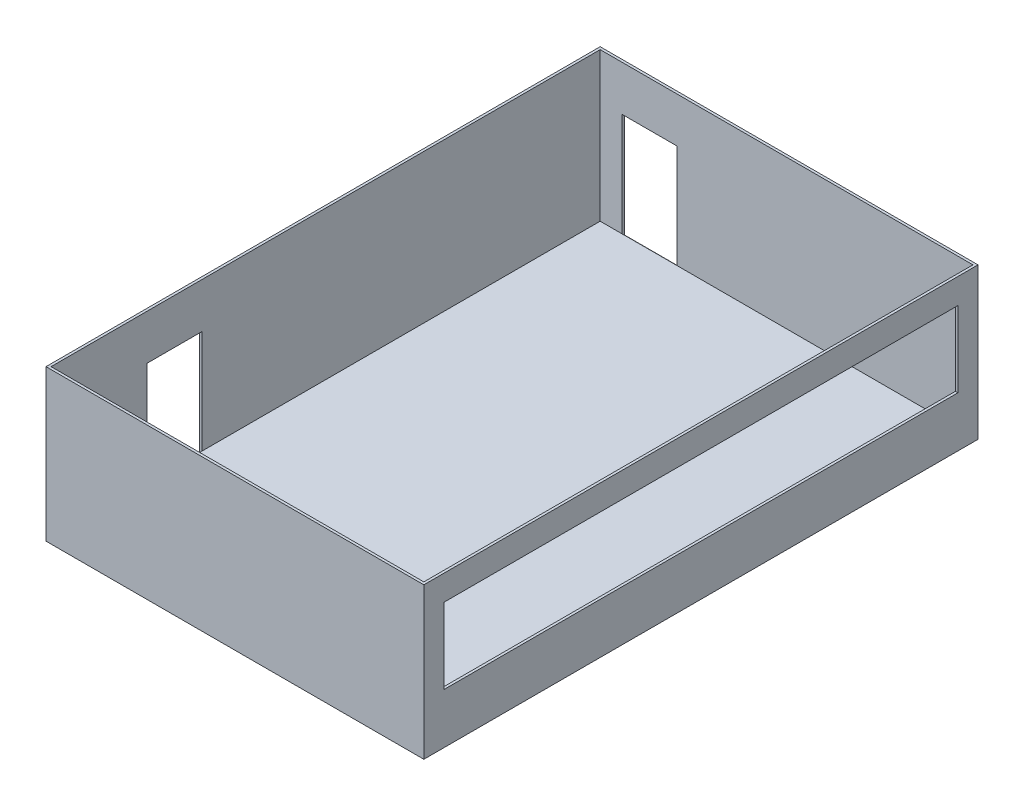
ISO-10303-21;
HEADER;
FILE_DESCRIPTION(('STEP AP214'),'2;1');
FILE_NAME('part.step','',(''),(''),'','','');
FILE_SCHEMA(('AUTOMOTIVE_DESIGN { 1 0 10303 214 1 1 1 1 }'));
ENDSEC;
DATA;
#1=APPLICATION_CONTEXT('core data for automotive mechanical design processes');
#2=APPLICATION_PROTOCOL_DEFINITION('international standard','automotive_design',2000,#1);
#3=PRODUCT_CONTEXT('',#1,'mechanical');
#4=PRODUCT('Part','Part','',(#3));
#5=PRODUCT_RELATED_PRODUCT_CATEGORY('part','',(#4));
#6=PRODUCT_DEFINITION_FORMATION('','',#4);
#7=PRODUCT_DEFINITION_CONTEXT('part definition',#1,'design');
#8=PRODUCT_DEFINITION('design','',#6,#7);
#9=PRODUCT_DEFINITION_SHAPE('','',#8);
#10=(LENGTH_UNIT() NAMED_UNIT(*) SI_UNIT(.MILLI.,.METRE.));
#11=(NAMED_UNIT(*) PLANE_ANGLE_UNIT() SI_UNIT($,.RADIAN.));
#12=(NAMED_UNIT(*) SI_UNIT($,.STERADIAN.) SOLID_ANGLE_UNIT());
#13=UNCERTAINTY_MEASURE_WITH_UNIT(LENGTH_MEASURE(1.E-05),#10,'distance_accuracy_value','');
#14=(GEOMETRIC_REPRESENTATION_CONTEXT(3) GLOBAL_UNCERTAINTY_ASSIGNED_CONTEXT((#13)) GLOBAL_UNIT_ASSIGNED_CONTEXT((#10,
#11,#12)) REPRESENTATION_CONTEXT('',''));
#15=CARTESIAN_POINT('',(0.,0.,0.));
#16=DIRECTION('',(0.,0.,1.));
#17=DIRECTION('',(1.,0.,0.));
#18=AXIS2_PLACEMENT_3D('',#15,#16,#17);
#19=CARTESIAN_POINT('',(-3750.,3000.,5500.));
#20=DIRECTION('',(1.,0.,0.));
#21=DIRECTION('',(0.,0.,-1.));
#22=AXIS2_PLACEMENT_3D('',#19,#20,#21);
#23=PLANE('',#22);
#24=DIRECTION('',(0.,0.,1.));
#25=VECTOR('',#24,1.);
#26=CARTESIAN_POINT('',(-3750.,0.,5500.));
#27=LINE('',#26,#25);
#28=CARTESIAN_POINT('',(-3750.,0.,-5500.));
#29=VERTEX_POINT('',#28);
#30=CARTESIAN_POINT('',(-3750.,0.,5500.));
#31=VERTEX_POINT('',#30);
#32=EDGE_CURVE('E290',#29,#31,#27,.T.);
#33=ORIENTED_EDGE('',*,*,#32,.T.);
#34=DIRECTION('',(0.,-1.,0.));
#35=VECTOR('',#34,1.);
#36=CARTESIAN_POINT('',(-3750.,3000.,5500.));
#37=LINE('',#36,#35);
#38=CARTESIAN_POINT('',(-3750.,3000.,5500.));
#39=VERTEX_POINT('',#38);
#40=EDGE_CURVE('E11',#39,#31,#37,.T.);
#41=ORIENTED_EDGE('',*,*,#40,.F.);
#42=DIRECTION('',(0.,0.,1.));
#43=VECTOR('',#42,1.);
#44=CARTESIAN_POINT('',(-3750.,3000.,5500.));
#45=LINE('',#44,#43);
#46=CARTESIAN_POINT('',(-3750.,3000.,-5500.));
#47=VERTEX_POINT('',#46);
#48=EDGE_CURVE('E317',#47,#39,#45,.T.);
#49=ORIENTED_EDGE('',*,*,#48,.F.);
#50=DIRECTION('',(0.,-1.,0.));
#51=VECTOR('',#50,1.);
#52=CARTESIAN_POINT('',(-3750.,3000.,-5500.));
#53=LINE('',#52,#51);
#54=EDGE_CURVE('E327',#47,#29,#53,.T.);
#55=ORIENTED_EDGE('',*,*,#54,.T.);
#56=EDGE_LOOP('',(#33,#41,#49,#55));
#57=FACE_BOUND('',#56,.T.);
#58=DIRECTION('',(0.,-1.,0.));
#59=VECTOR('',#58,1.);
#60=CARTESIAN_POINT('',(-3750.,0.,3550.));
#61=LINE('',#60,#59);
#62=CARTESIAN_POINT('',(-3750.,2105.,3550.));
#63=VERTEX_POINT('',#62);
#64=CARTESIAN_POINT('',(-3750.,4.99999999999989,3550.));
#65=VERTEX_POINT('',#64);
#66=EDGE_CURVE('E46',#63,#65,#61,.T.);
#67=ORIENTED_EDGE('',*,*,#66,.T.);
#68=DIRECTION('',(0.,0.,1.));
#69=VECTOR('',#68,1.);
#70=CARTESIAN_POINT('',(-3750.,4.99999999999989,0.));
#71=LINE('',#70,#69);
#72=CARTESIAN_POINT('',(-3750.,4.99999999999989,2450.));
#73=VERTEX_POINT('',#72);
#74=EDGE_CURVE('E200',#73,#65,#71,.T.);
#75=ORIENTED_EDGE('',*,*,#74,.F.);
#76=DIRECTION('',(0.,-1.,0.));
#77=VECTOR('',#76,1.);
#78=CARTESIAN_POINT('',(-3750.,0.,2450.));
#79=LINE('',#78,#77);
#80=CARTESIAN_POINT('',(-3750.,2105.,2450.));
#81=VERTEX_POINT('',#80);
#82=EDGE_CURVE('E209',#81,#73,#79,.T.);
#83=ORIENTED_EDGE('',*,*,#82,.F.);
#84=DIRECTION('',(0.,0.,1.));
#85=VECTOR('',#84,1.);
#86=CARTESIAN_POINT('',(-3750.,2105.,0.));
#87=LINE('',#86,#85);
#88=EDGE_CURVE('E207',#81,#63,#87,.T.);
#89=ORIENTED_EDGE('',*,*,#88,.T.);
#90=EDGE_LOOP('',(#67,#75,#83,#89));
#91=FACE_BOUND('',#90,.T.);
#92=ADVANCED_FACE('F32',(#57,#91),#23,.F.);
#93=CARTESIAN_POINT('',(-3700.,3000.,5500.));
#94=DIRECTION('',(1.,0.,0.));
#95=DIRECTION('',(0.,0.,-1.));
#96=AXIS2_PLACEMENT_3D('',#93,#94,#95);
#97=PLANE('',#96);
#98=DIRECTION('',(0.,0.,1.));
#99=VECTOR('',#98,1.);
#100=CARTESIAN_POINT('',(-3700.,49.9999999999998,5500.));
#101=LINE('',#100,#99);
#102=CARTESIAN_POINT('',(-3700.,49.9999999999998,3550.));
#103=VERTEX_POINT('',#102);
#104=CARTESIAN_POINT('',(-3700.,50.,5450.));
#105=VERTEX_POINT('',#104);
#106=EDGE_CURVE('E196',#103,#105,#101,.T.);
#107=ORIENTED_EDGE('',*,*,#106,.F.);
#108=DIRECTION('',(0.,-1.,0.));
#109=VECTOR('',#108,1.);
#110=CARTESIAN_POINT('',(-3700.,0.,3550.));
#111=LINE('',#110,#109);
#112=CARTESIAN_POINT('',(-3700.,2105.,3550.));
#113=VERTEX_POINT('',#112);
#114=EDGE_CURVE('E52',#113,#103,#111,.T.);
#115=ORIENTED_EDGE('',*,*,#114,.F.);
#116=DIRECTION('',(0.,0.,1.));
#117=VECTOR('',#116,1.);
#118=CARTESIAN_POINT('',(-3700.,2105.,0.));
#119=LINE('',#118,#117);
#120=CARTESIAN_POINT('',(-3700.,2105.,2450.));
#121=VERTEX_POINT('',#120);
#122=EDGE_CURVE('E179',#121,#113,#119,.T.);
#123=ORIENTED_EDGE('',*,*,#122,.F.);
#124=DIRECTION('',(0.,-1.,0.));
#125=VECTOR('',#124,1.);
#126=CARTESIAN_POINT('',(-3700.,0.,2450.));
#127=LINE('',#126,#125);
#128=CARTESIAN_POINT('',(-3700.,50.,2450.));
#129=VERTEX_POINT('',#128);
#130=EDGE_CURVE('E202',#121,#129,#127,.T.);
#131=ORIENTED_EDGE('',*,*,#130,.T.);
#132=CARTESIAN_POINT('',(-3700.,50.,-5450.));
#133=VERTEX_POINT('',#132);
#134=EDGE_CURVE('E283',#133,#129,#101,.T.);
#135=ORIENTED_EDGE('',*,*,#134,.F.);
#136=DIRECTION('',(0.,-1.,0.));
#137=VECTOR('',#136,1.);
#138=CARTESIAN_POINT('',(-3700.,3000.,-5450.));
#139=LINE('',#138,#137);
#140=CARTESIAN_POINT('',(-3700.,3000.,-5450.));
#141=VERTEX_POINT('',#140);
#142=EDGE_CURVE('E292',#141,#133,#139,.T.);
#143=ORIENTED_EDGE('',*,*,#142,.F.);
#144=DIRECTION('',(0.,0.,1.));
#145=VECTOR('',#144,1.);
#146=CARTESIAN_POINT('',(-3700.,3000.,5500.));
#147=LINE('',#146,#145);
#148=CARTESIAN_POINT('',(-3700.,3000.,5450.));
#149=VERTEX_POINT('',#148);
#150=EDGE_CURVE('E308',#141,#149,#147,.T.);
#151=ORIENTED_EDGE('',*,*,#150,.T.);
#152=DIRECTION('',(0.,-1.,0.));
#153=VECTOR('',#152,1.);
#154=CARTESIAN_POINT('',(-3700.,3000.,5450.));
#155=LINE('',#154,#153);
#156=EDGE_CURVE('E288',#149,#105,#155,.T.);
#157=ORIENTED_EDGE('',*,*,#156,.T.);
#158=EDGE_LOOP('',(#107,#115,#123,#131,#135,#143,#151,#157));
#159=FACE_BOUND('',#158,.T.);
#160=ADVANCED_FACE('F194',(#159),#97,.T.);
#161=CARTESIAN_POINT('',(3750.,3000.,5500.));
#162=DIRECTION('',(-1.,0.,0.));
#163=DIRECTION('',(0.,0.,1.));
#164=AXIS2_PLACEMENT_3D('',#161,#162,#163);
#165=PLANE('',#164);
#166=DIRECTION('',(0.,0.,-1.));
#167=VECTOR('',#166,1.);
#168=CARTESIAN_POINT('',(3750.,0.,5500.));
#169=LINE('',#168,#167);
#170=CARTESIAN_POINT('',(3750.,0.,5500.));
#171=VERTEX_POINT('',#170);
#172=CARTESIAN_POINT('',(3750.,0.,-5500.));
#173=VERTEX_POINT('',#172);
#174=EDGE_CURVE('E332',#171,#173,#169,.T.);
#175=ORIENTED_EDGE('',*,*,#174,.T.);
#176=DIRECTION('',(0.,-1.,0.));
#177=VECTOR('',#176,1.);
#178=CARTESIAN_POINT('',(3750.,3000.,-5500.));
#179=LINE('',#178,#177);
#180=CARTESIAN_POINT('',(3750.,3000.,-5500.));
#181=VERTEX_POINT('',#180);
#182=EDGE_CURVE('E337',#181,#173,#179,.T.);
#183=ORIENTED_EDGE('',*,*,#182,.F.);
#184=DIRECTION('',(0.,0.,-1.));
#185=VECTOR('',#184,1.);
#186=CARTESIAN_POINT('',(3750.,3000.,5500.));
#187=LINE('',#186,#185);
#188=CARTESIAN_POINT('',(3750.,3000.,5500.));
#189=VERTEX_POINT('',#188);
#190=EDGE_CURVE('E323',#189,#181,#187,.T.);
#191=ORIENTED_EDGE('',*,*,#190,.F.);
#192=DIRECTION('',(0.,-1.,0.));
#193=VECTOR('',#192,1.);
#194=CARTESIAN_POINT('',(3750.,3000.,5500.));
#195=LINE('',#194,#193);
#196=EDGE_CURVE('E39',#189,#171,#195,.T.);
#197=ORIENTED_EDGE('',*,*,#196,.T.);
#198=EDGE_LOOP('',(#175,#183,#191,#197));
#199=FACE_BOUND('',#198,.T.);
#200=DIRECTION('',(0.,-1.,0.));
#201=VECTOR('',#200,1.);
#202=CARTESIAN_POINT('',(3750.,0.,-5100.));
#203=LINE('',#202,#201);
#204=CARTESIAN_POINT('',(3750.,2500.,-5100.));
#205=VERTEX_POINT('',#204);
#206=CARTESIAN_POINT('',(3750.,1000.,-5100.));
#207=VERTEX_POINT('',#206);
#208=EDGE_CURVE('E264',#205,#207,#203,.T.);
#209=ORIENTED_EDGE('',*,*,#208,.T.);
#210=DIRECTION('',(0.,0.,-1.));
#211=VECTOR('',#210,1.);
#212=CARTESIAN_POINT('',(3750.,1000.,0.));
#213=LINE('',#212,#211);
#214=CARTESIAN_POINT('',(3750.,1000.,5100.));
#215=VERTEX_POINT('',#214);
#216=EDGE_CURVE('E255',#215,#207,#213,.T.);
#217=ORIENTED_EDGE('',*,*,#216,.F.);
#218=DIRECTION('',(0.,-1.,0.));
#219=VECTOR('',#218,1.);
#220=CARTESIAN_POINT('',(3750.,0.,5100.));
#221=LINE('',#220,#219);
#222=CARTESIAN_POINT('',(3750.,2500.,5100.));
#223=VERTEX_POINT('',#222);
#224=EDGE_CURVE('E256',#223,#215,#221,.T.);
#225=ORIENTED_EDGE('',*,*,#224,.F.);
#226=DIRECTION('',(0.,0.,-1.));
#227=VECTOR('',#226,1.);
#228=CARTESIAN_POINT('',(3750.,2500.,0.));
#229=LINE('',#228,#227);
#230=EDGE_CURVE('E259',#223,#205,#229,.T.);
#231=ORIENTED_EDGE('',*,*,#230,.T.);
#232=EDGE_LOOP('',(#209,#217,#225,#231));
#233=FACE_BOUND('',#232,.T.);
#234=ADVANCED_FACE('F344',(#199,#233),#165,.F.);
#235=CARTESIAN_POINT('',(3700.,3000.,5500.));
#236=DIRECTION('',(-1.,0.,0.));
#237=DIRECTION('',(0.,0.,1.));
#238=AXIS2_PLACEMENT_3D('',#235,#236,#237);
#239=PLANE('',#238);
#240=DIRECTION('',(0.,0.,-1.));
#241=VECTOR('',#240,1.);
#242=CARTESIAN_POINT('',(3700.,49.9999999999998,5500.));
#243=LINE('',#242,#241);
#244=CARTESIAN_POINT('',(3700.,50.,5450.));
#245=VERTEX_POINT('',#244);
#246=CARTESIAN_POINT('',(3700.,50.,-5450.));
#247=VERTEX_POINT('',#246);
#248=EDGE_CURVE('E298',#245,#247,#243,.T.);
#249=ORIENTED_EDGE('',*,*,#248,.F.);
#250=DIRECTION('',(0.,-1.,0.));
#251=VECTOR('',#250,1.);
#252=CARTESIAN_POINT('',(3700.,3000.,5450.));
#253=LINE('',#252,#251);
#254=CARTESIAN_POINT('',(3700.,3000.,5450.));
#255=VERTEX_POINT('',#254);
#256=EDGE_CURVE('E291',#255,#245,#253,.T.);
#257=ORIENTED_EDGE('',*,*,#256,.F.);
#258=DIRECTION('',(0.,0.,-1.));
#259=VECTOR('',#258,1.);
#260=CARTESIAN_POINT('',(3700.,3000.,5500.));
#261=LINE('',#260,#259);
#262=CARTESIAN_POINT('',(3700.,3000.,-5450.));
#263=VERTEX_POINT('',#262);
#264=EDGE_CURVE('E313',#255,#263,#261,.T.);
#265=ORIENTED_EDGE('',*,*,#264,.T.);
#266=DIRECTION('',(0.,-1.,0.));
#267=VECTOR('',#266,1.);
#268=CARTESIAN_POINT('',(3700.,3000.,-5450.));
#269=LINE('',#268,#267);
#270=EDGE_CURVE('E295',#263,#247,#269,.T.);
#271=ORIENTED_EDGE('',*,*,#270,.T.);
#272=EDGE_LOOP('',(#249,#257,#265,#271));
#273=FACE_BOUND('',#272,.T.);
#274=DIRECTION('',(0.,0.,-1.));
#275=VECTOR('',#274,1.);
#276=CARTESIAN_POINT('',(3700.,1000.,0.));
#277=LINE('',#276,#275);
#278=CARTESIAN_POINT('',(3700.,1000.,5100.));
#279=VERTEX_POINT('',#278);
#280=CARTESIAN_POINT('',(3700.,1000.,-5100.));
#281=VERTEX_POINT('',#280);
#282=EDGE_CURVE('E269',#279,#281,#277,.T.);
#283=ORIENTED_EDGE('',*,*,#282,.T.);
#284=DIRECTION('',(0.,-1.,0.));
#285=VECTOR('',#284,1.);
#286=CARTESIAN_POINT('',(3700.,0.,-5100.));
#287=LINE('',#286,#285);
#288=CARTESIAN_POINT('',(3700.,2500.,-5100.));
#289=VERTEX_POINT('',#288);
#290=EDGE_CURVE('E253',#289,#281,#287,.T.);
#291=ORIENTED_EDGE('',*,*,#290,.F.);
#292=DIRECTION('',(0.,0.,-1.));
#293=VECTOR('',#292,1.);
#294=CARTESIAN_POINT('',(3700.,2500.,0.));
#295=LINE('',#294,#293);
#296=CARTESIAN_POINT('',(3700.,2500.,5100.));
#297=VERTEX_POINT('',#296);
#298=EDGE_CURVE('E246',#297,#289,#295,.T.);
#299=ORIENTED_EDGE('',*,*,#298,.F.);
#300=DIRECTION('',(0.,-1.,0.));
#301=VECTOR('',#300,1.);
#302=CARTESIAN_POINT('',(3700.,0.,5100.));
#303=LINE('',#302,#301);
#304=EDGE_CURVE('E262',#297,#279,#303,.T.);
#305=ORIENTED_EDGE('',*,*,#304,.T.);
#306=EDGE_LOOP('',(#283,#291,#299,#305));
#307=FACE_BOUND('',#306,.T.);
#308=ADVANCED_FACE('F364',(#273,#307),#239,.T.);
#309=CARTESIAN_POINT('',(3750.,3000.,5500.));
#310=DIRECTION('',(0.,0.,-1.));
#311=DIRECTION('',(-1.,0.,0.));
#312=AXIS2_PLACEMENT_3D('',#309,#310,#311);
#313=PLANE('',#312);
#314=DIRECTION('',(1.,0.,0.));
#315=VECTOR('',#314,1.);
#316=CARTESIAN_POINT('',(3750.,0.,5500.));
#317=LINE('',#316,#315);
#318=EDGE_CURVE('E330',#31,#171,#317,.T.);
#319=ORIENTED_EDGE('',*,*,#318,.T.);
#320=ORIENTED_EDGE('',*,*,#196,.F.);
#321=DIRECTION('',(1.,0.,0.));
#322=VECTOR('',#321,1.);
#323=CARTESIAN_POINT('',(3750.,3000.,5500.));
#324=LINE('',#323,#322);
#325=EDGE_CURVE('E320',#39,#189,#324,.T.);
#326=ORIENTED_EDGE('',*,*,#325,.F.);
#327=ORIENTED_EDGE('',*,*,#40,.T.);
#328=EDGE_LOOP('',(#319,#320,#326,#327));
#329=FACE_BOUND('',#328,.T.);
#330=ADVANCED_FACE('F362',(#329),#313,.F.);
#331=CARTESIAN_POINT('',(3750.,3000.,-5500.));
#332=DIRECTION('',(0.,0.,1.));
#333=DIRECTION('',(1.,0.,0.));
#334=AXIS2_PLACEMENT_3D('',#331,#332,#333);
#335=PLANE('',#334);
#336=DIRECTION('',(-1.,0.,0.));
#337=VECTOR('',#336,1.);
#338=CARTESIAN_POINT('',(-2170.,4.99999999999989,-5500.));
#339=LINE('',#338,#337);
#340=CARTESIAN_POINT('',(-2170.,4.99999999999989,-5500.));
#341=VERTEX_POINT('',#340);
#342=CARTESIAN_POINT('',(-3270.,4.99999999999989,-5500.));
#343=VERTEX_POINT('',#342);
#344=EDGE_CURVE('E235',#341,#343,#339,.T.);
#345=ORIENTED_EDGE('',*,*,#344,.F.);
#346=DIRECTION('',(0.,-1.,0.));
#347=VECTOR('',#346,1.);
#348=CARTESIAN_POINT('',(-2170.,2105.,-5500.));
#349=LINE('',#348,#347);
#350=CARTESIAN_POINT('',(-2170.,2105.,-5500.));
#351=VERTEX_POINT('',#350);
#352=EDGE_CURVE('E216',#351,#341,#349,.T.);
#353=ORIENTED_EDGE('',*,*,#352,.F.);
#354=DIRECTION('',(1.,0.,0.));
#355=VECTOR('',#354,1.);
#356=CARTESIAN_POINT('',(-2170.,2105.,-5500.));
#357=LINE('',#356,#355);
#358=CARTESIAN_POINT('',(-3270.,2105.,-5500.));
#359=VERTEX_POINT('',#358);
#360=EDGE_CURVE('E241',#359,#351,#357,.T.);
#361=ORIENTED_EDGE('',*,*,#360,.F.);
#362=DIRECTION('',(0.,1.,0.));
#363=VECTOR('',#362,1.);
#364=CARTESIAN_POINT('',(-3270.,2105.,-5500.));
#365=LINE('',#364,#363);
#366=EDGE_CURVE('E238',#343,#359,#365,.T.);
#367=ORIENTED_EDGE('',*,*,#366,.F.);
#368=EDGE_LOOP('',(#345,#353,#361,#367));
#369=FACE_BOUND('',#368,.T.);
#370=DIRECTION('',(-1.,0.,0.));
#371=VECTOR('',#370,1.);
#372=CARTESIAN_POINT('',(3750.,0.,-5500.));
#373=LINE('',#372,#371);
#374=EDGE_CURVE('E321',#173,#29,#373,.T.);
#375=ORIENTED_EDGE('',*,*,#374,.T.);
#376=ORIENTED_EDGE('',*,*,#54,.F.);
#377=DIRECTION('',(-1.,0.,0.));
#378=VECTOR('',#377,1.);
#379=CARTESIAN_POINT('',(3750.,3000.,-5500.));
#380=LINE('',#379,#378);
#381=EDGE_CURVE('E325',#181,#47,#380,.T.);
#382=ORIENTED_EDGE('',*,*,#381,.F.);
#383=ORIENTED_EDGE('',*,*,#182,.T.);
#384=EDGE_LOOP('',(#375,#376,#382,#383));
#385=FACE_BOUND('',#384,.T.);
#386=ADVANCED_FACE('F354',(#369,#385),#335,.F.);
#387=CARTESIAN_POINT('',(0.,3000.,0.));
#388=DIRECTION('',(0.,1.,0.));
#389=DIRECTION('',(0.,0.,1.));
#390=AXIS2_PLACEMENT_3D('',#387,#388,#389);
#391=PLANE('',#390);
#392=ORIENTED_EDGE('',*,*,#150,.F.);
#393=DIRECTION('',(-1.,0.,0.));
#394=VECTOR('',#393,1.);
#395=CARTESIAN_POINT('',(3750.,3000.,-5450.));
#396=LINE('',#395,#394);
#397=EDGE_CURVE('E296',#263,#141,#396,.T.);
#398=ORIENTED_EDGE('',*,*,#397,.F.);
#399=ORIENTED_EDGE('',*,*,#264,.F.);
#400=DIRECTION('',(1.,0.,0.));
#401=VECTOR('',#400,1.);
#402=CARTESIAN_POINT('',(3750.,3000.,5450.));
#403=LINE('',#402,#401);
#404=EDGE_CURVE('E311',#149,#255,#403,.T.);
#405=ORIENTED_EDGE('',*,*,#404,.F.);
#406=EDGE_LOOP('',(#392,#398,#399,#405));
#407=FACE_BOUND('',#406,.T.);
#408=ORIENTED_EDGE('',*,*,#48,.T.);
#409=ORIENTED_EDGE('',*,*,#325,.T.);
#410=ORIENTED_EDGE('',*,*,#190,.T.);
#411=ORIENTED_EDGE('',*,*,#381,.T.);
#412=EDGE_LOOP('',(#408,#409,#410,#411));
#413=FACE_BOUND('',#412,.T.);
#414=ADVANCED_FACE('F361',(#407,#413),#391,.T.);
#415=CARTESIAN_POINT('',(0.,0.,0.));
#416=DIRECTION('',(0.,1.,0.));
#417=DIRECTION('',(0.,0.,1.));
#418=AXIS2_PLACEMENT_3D('',#415,#416,#417);
#419=PLANE('',#418);
#420=ORIENTED_EDGE('',*,*,#32,.F.);
#421=ORIENTED_EDGE('',*,*,#374,.F.);
#422=ORIENTED_EDGE('',*,*,#174,.F.);
#423=ORIENTED_EDGE('',*,*,#318,.F.);
#424=EDGE_LOOP('',(#420,#421,#422,#423));
#425=FACE_BOUND('',#424,.T.);
#426=ADVANCED_FACE('F351',(#425),#419,.F.);
#427=CARTESIAN_POINT('',(3750.,3000.,5450.));
#428=DIRECTION('',(0.,0.,-1.));
#429=DIRECTION('',(-1.,0.,0.));
#430=AXIS2_PLACEMENT_3D('',#427,#428,#429);
#431=PLANE('',#430);
#432=DIRECTION('',(1.,0.,0.));
#433=VECTOR('',#432,1.);
#434=CARTESIAN_POINT('',(3750.,49.9999999999998,5450.));
#435=LINE('',#434,#433);
#436=EDGE_CURVE('E286',#105,#245,#435,.T.);
#437=ORIENTED_EDGE('',*,*,#436,.F.);
#438=ORIENTED_EDGE('',*,*,#156,.F.);
#439=ORIENTED_EDGE('',*,*,#404,.T.);
#440=ORIENTED_EDGE('',*,*,#256,.T.);
#441=EDGE_LOOP('',(#437,#438,#439,#440));
#442=FACE_BOUND('',#441,.T.);
#443=ADVANCED_FACE('F389',(#442),#431,.T.);
#444=CARTESIAN_POINT('',(3750.,3000.,-5450.));
#445=DIRECTION('',(0.,0.,1.));
#446=DIRECTION('',(1.,0.,0.));
#447=AXIS2_PLACEMENT_3D('',#444,#445,#446);
#448=PLANE('',#447);
#449=DIRECTION('',(0.,-1.,0.));
#450=VECTOR('',#449,1.);
#451=CARTESIAN_POINT('',(-2170.,2105.,-5450.));
#452=LINE('',#451,#450);
#453=CARTESIAN_POINT('',(-2170.,2105.,-5450.));
#454=VERTEX_POINT('',#453);
#455=CARTESIAN_POINT('',(-2170.,49.9999999999998,-5450.));
#456=VERTEX_POINT('',#455);
#457=EDGE_CURVE('E220',#454,#456,#452,.T.);
#458=ORIENTED_EDGE('',*,*,#457,.T.);
#459=DIRECTION('',(-1.,0.,0.));
#460=VECTOR('',#459,1.);
#461=CARTESIAN_POINT('',(3750.,49.9999999999998,-5450.));
#462=LINE('',#461,#460);
#463=EDGE_CURVE('E305',#247,#456,#462,.T.);
#464=ORIENTED_EDGE('',*,*,#463,.F.);
#465=ORIENTED_EDGE('',*,*,#270,.F.);
#466=ORIENTED_EDGE('',*,*,#397,.T.);
#467=ORIENTED_EDGE('',*,*,#142,.T.);
#468=CARTESIAN_POINT('',(-3270.,49.9999999999998,-5450.));
#469=VERTEX_POINT('',#468);
#470=EDGE_CURVE('E302',#469,#133,#462,.T.);
#471=ORIENTED_EDGE('',*,*,#470,.F.);
#472=DIRECTION('',(0.,1.,0.));
#473=VECTOR('',#472,1.);
#474=CARTESIAN_POINT('',(-3270.,2105.,-5450.));
#475=LINE('',#474,#473);
#476=CARTESIAN_POINT('',(-3270.,2105.,-5450.));
#477=VERTEX_POINT('',#476);
#478=EDGE_CURVE('E227',#469,#477,#475,.T.);
#479=ORIENTED_EDGE('',*,*,#478,.T.);
#480=DIRECTION('',(1.,0.,0.));
#481=VECTOR('',#480,1.);
#482=CARTESIAN_POINT('',(-2170.,2105.,-5450.));
#483=LINE('',#482,#481);
#484=EDGE_CURVE('E230',#477,#454,#483,.T.);
#485=ORIENTED_EDGE('',*,*,#484,.T.);
#486=EDGE_LOOP('',(#458,#464,#465,#466,#467,#471,#479,#485));
#487=FACE_BOUND('',#486,.T.);
#488=ADVANCED_FACE('F391',(#487),#448,.T.);
#489=CARTESIAN_POINT('',(0.,50.,0.));
#490=DIRECTION('',(0.,1.,0.));
#491=DIRECTION('',(0.,0.,1.));
#492=AXIS2_PLACEMENT_3D('',#489,#490,#491);
#493=PLANE('',#492);
#494=ORIENTED_EDGE('',*,*,#134,.T.);
#495=EDGE_CURVE('E287',#129,#103,#101,.T.);
#496=ORIENTED_EDGE('',*,*,#495,.T.);
#497=ORIENTED_EDGE('',*,*,#106,.T.);
#498=ORIENTED_EDGE('',*,*,#436,.T.);
#499=ORIENTED_EDGE('',*,*,#248,.T.);
#500=ORIENTED_EDGE('',*,*,#463,.T.);
#501=EDGE_CURVE('E309',#456,#469,#462,.T.);
#502=ORIENTED_EDGE('',*,*,#501,.T.);
#503=ORIENTED_EDGE('',*,*,#470,.T.);
#504=EDGE_LOOP('',(#494,#496,#497,#498,#499,#500,#502,#503));
#505=FACE_BOUND('',#504,.T.);
#506=ADVANCED_FACE('F396',(#505),#493,.T.);
#507=CARTESIAN_POINT('',(-3750.001,0.,-5100.));
#508=DIRECTION('',(0.,0.,1.));
#509=DIRECTION('',(1.,0.,0.));
#510=AXIS2_PLACEMENT_3D('',#507,#508,#509);
#511=PLANE('',#510);
#512=ORIENTED_EDGE('',*,*,#290,.T.);
#513=DIRECTION('',(1.,0.,0.));
#514=VECTOR('',#513,1.);
#515=CARTESIAN_POINT('',(-3750.001,1000.,-5100.));
#516=LINE('',#515,#514);
#517=EDGE_CURVE('E272',#281,#207,#516,.T.);
#518=ORIENTED_EDGE('',*,*,#517,.T.);
#519=ORIENTED_EDGE('',*,*,#208,.F.);
#520=DIRECTION('',(1.,0.,0.));
#521=VECTOR('',#520,1.);
#522=CARTESIAN_POINT('',(-3750.001,2500.,-5100.));
#523=LINE('',#522,#521);
#524=EDGE_CURVE('E258',#289,#205,#523,.T.);
#525=ORIENTED_EDGE('',*,*,#524,.F.);
#526=EDGE_LOOP('',(#512,#518,#519,#525));
#527=FACE_BOUND('',#526,.T.);
#528=ADVANCED_FACE('F387',(#527),#511,.T.);
#529=CARTESIAN_POINT('',(-3750.001,2500.,0.));
#530=DIRECTION('',(0.,-1.,0.));
#531=DIRECTION('',(0.,0.,-1.));
#532=AXIS2_PLACEMENT_3D('',#529,#530,#531);
#533=PLANE('',#532);
#534=ORIENTED_EDGE('',*,*,#298,.T.);
#535=ORIENTED_EDGE('',*,*,#524,.T.);
#536=ORIENTED_EDGE('',*,*,#230,.F.);
#537=DIRECTION('',(1.,0.,0.));
#538=VECTOR('',#537,1.);
#539=CARTESIAN_POINT('',(-3750.001,2500.,5100.));
#540=LINE('',#539,#538);
#541=EDGE_CURVE('E263',#297,#223,#540,.T.);
#542=ORIENTED_EDGE('',*,*,#541,.F.);
#543=EDGE_LOOP('',(#534,#535,#536,#542));
#544=FACE_BOUND('',#543,.T.);
#545=ADVANCED_FACE('F434',(#544),#533,.T.);
#546=CARTESIAN_POINT('',(-3750.001,0.,5100.));
#547=DIRECTION('',(0.,0.,1.));
#548=DIRECTION('',(1.,0.,0.));
#549=AXIS2_PLACEMENT_3D('',#546,#547,#548);
#550=PLANE('',#549);
#551=ORIENTED_EDGE('',*,*,#541,.T.);
#552=ORIENTED_EDGE('',*,*,#224,.T.);
#553=DIRECTION('',(1.,0.,0.));
#554=VECTOR('',#553,1.);
#555=CARTESIAN_POINT('',(-3750.001,1000.,5100.));
#556=LINE('',#555,#554);
#557=EDGE_CURVE('E273',#279,#215,#556,.T.);
#558=ORIENTED_EDGE('',*,*,#557,.F.);
#559=ORIENTED_EDGE('',*,*,#304,.F.);
#560=EDGE_LOOP('',(#551,#552,#558,#559));
#561=FACE_BOUND('',#560,.T.);
#562=ADVANCED_FACE('F442',(#561),#550,.F.);
#563=CARTESIAN_POINT('',(-3750.001,1000.,0.));
#564=DIRECTION('',(0.,-1.,0.));
#565=DIRECTION('',(0.,0.,-1.));
#566=AXIS2_PLACEMENT_3D('',#563,#564,#565);
#567=PLANE('',#566);
#568=ORIENTED_EDGE('',*,*,#557,.T.);
#569=ORIENTED_EDGE('',*,*,#216,.T.);
#570=ORIENTED_EDGE('',*,*,#517,.F.);
#571=ORIENTED_EDGE('',*,*,#282,.F.);
#572=EDGE_LOOP('',(#568,#569,#570,#571));
#573=FACE_BOUND('',#572,.T.);
#574=ADVANCED_FACE('F449',(#573),#567,.F.);
#575=CARTESIAN_POINT('',(-2170.,2105.,-5450.));
#576=DIRECTION('',(1.,0.,0.));
#577=DIRECTION('',(0.,0.,-1.));
#578=AXIS2_PLACEMENT_3D('',#575,#576,#577);
#579=PLANE('',#578);
#580=ORIENTED_EDGE('',*,*,#352,.T.);
#581=DIRECTION('',(0.,0.,-1.));
#582=VECTOR('',#581,1.);
#583=CARTESIAN_POINT('',(-2170.,4.99999999999989,-5450.));
#584=LINE('',#583,#582);
#585=CARTESIAN_POINT('',(-2170.,4.99999999999989,-5450.));
#586=VERTEX_POINT('',#585);
#587=EDGE_CURVE('E233',#586,#341,#584,.T.);
#588=ORIENTED_EDGE('',*,*,#587,.F.);
#589=EDGE_CURVE('E224',#456,#586,#452,.T.);
#590=ORIENTED_EDGE('',*,*,#589,.F.);
#591=ORIENTED_EDGE('',*,*,#457,.F.);
#592=DIRECTION('',(0.,0.,-1.));
#593=VECTOR('',#592,1.);
#594=CARTESIAN_POINT('',(-2170.,2105.,-5450.));
#595=LINE('',#594,#593);
#596=EDGE_CURVE('E244',#454,#351,#595,.T.);
#597=ORIENTED_EDGE('',*,*,#596,.T.);
#598=EDGE_LOOP('',(#580,#588,#590,#591,#597));
#599=FACE_BOUND('',#598,.T.);
#600=ADVANCED_FACE('F457',(#599),#579,.F.);
#601=CARTESIAN_POINT('',(-2170.,2105.,-5450.));
#602=DIRECTION('',(0.,1.,0.));
#603=DIRECTION('',(0.,0.,1.));
#604=AXIS2_PLACEMENT_3D('',#601,#602,#603);
#605=PLANE('',#604);
#606=ORIENTED_EDGE('',*,*,#360,.T.);
#607=ORIENTED_EDGE('',*,*,#596,.F.);
#608=ORIENTED_EDGE('',*,*,#484,.F.);
#609=DIRECTION('',(0.,0.,-1.));
#610=VECTOR('',#609,1.);
#611=CARTESIAN_POINT('',(-3270.,2105.,-5450.));
#612=LINE('',#611,#610);
#613=EDGE_CURVE('E247',#477,#359,#612,.T.);
#614=ORIENTED_EDGE('',*,*,#613,.T.);
#615=EDGE_LOOP('',(#606,#607,#608,#614));
#616=FACE_BOUND('',#615,.T.);
#617=ADVANCED_FACE('F474',(#616),#605,.F.);
#618=CARTESIAN_POINT('',(-3270.,2105.,-5450.));
#619=DIRECTION('',(-1.,0.,0.));
#620=DIRECTION('',(0.,0.,1.));
#621=AXIS2_PLACEMENT_3D('',#618,#619,#620);
#622=PLANE('',#621);
#623=ORIENTED_EDGE('',*,*,#366,.T.);
#624=ORIENTED_EDGE('',*,*,#613,.F.);
#625=ORIENTED_EDGE('',*,*,#478,.F.);
#626=CARTESIAN_POINT('',(-3270.,4.99999999999989,-5450.));
#627=VERTEX_POINT('',#626);
#628=EDGE_CURVE('E228',#627,#469,#475,.T.);
#629=ORIENTED_EDGE('',*,*,#628,.F.);
#630=DIRECTION('',(0.,0.,-1.));
#631=VECTOR('',#630,1.);
#632=CARTESIAN_POINT('',(-3270.,4.99999999999989,-5450.));
#633=LINE('',#632,#631);
#634=EDGE_CURVE('E249',#627,#343,#633,.T.);
#635=ORIENTED_EDGE('',*,*,#634,.T.);
#636=EDGE_LOOP('',(#623,#624,#625,#629,#635));
#637=FACE_BOUND('',#636,.T.);
#638=ADVANCED_FACE('F482',(#637),#622,.F.);
#639=CARTESIAN_POINT('',(-2170.,4.99999999999989,-5450.));
#640=DIRECTION('',(0.,-1.,0.));
#641=DIRECTION('',(0.,0.,-1.));
#642=AXIS2_PLACEMENT_3D('',#639,#640,#641);
#643=PLANE('',#642);
#644=ORIENTED_EDGE('',*,*,#344,.T.);
#645=ORIENTED_EDGE('',*,*,#634,.F.);
#646=DIRECTION('',(-1.,0.,0.));
#647=VECTOR('',#646,1.);
#648=CARTESIAN_POINT('',(-2170.,4.99999999999989,-5450.));
#649=LINE('',#648,#647);
#650=EDGE_CURVE('E223',#586,#627,#649,.T.);
#651=ORIENTED_EDGE('',*,*,#650,.F.);
#652=ORIENTED_EDGE('',*,*,#587,.T.);
#653=EDGE_LOOP('',(#644,#645,#651,#652));
#654=FACE_BOUND('',#653,.T.);
#655=ADVANCED_FACE('F490',(#654),#643,.F.);
#656=CARTESIAN_POINT('',(0.,0.,-5450.));
#657=DIRECTION('',(0.,0.,-1.));
#658=DIRECTION('',(-1.,0.,0.));
#659=AXIS2_PLACEMENT_3D('',#656,#657,#658);
#660=PLANE('',#659);
#661=ORIENTED_EDGE('',*,*,#589,.T.);
#662=ORIENTED_EDGE('',*,*,#650,.T.);
#663=ORIENTED_EDGE('',*,*,#628,.T.);
#664=ORIENTED_EDGE('',*,*,#501,.F.);
#665=EDGE_LOOP('',(#661,#662,#663,#664));
#666=FACE_BOUND('',#665,.T.);
#667=ADVANCED_FACE('F498',(#666),#660,.T.);
#668=CARTESIAN_POINT('',(-3700.,0.,3550.));
#669=DIRECTION('',(0.,0.,-1.));
#670=DIRECTION('',(-1.,0.,0.));
#671=AXIS2_PLACEMENT_3D('',#668,#669,#670);
#672=PLANE('',#671);
#673=ORIENTED_EDGE('',*,*,#66,.F.);
#674=DIRECTION('',(-1.,0.,0.));
#675=VECTOR('',#674,1.);
#676=CARTESIAN_POINT('',(-3700.,2105.,3550.));
#677=LINE('',#676,#675);
#678=EDGE_CURVE('E182',#113,#63,#677,.T.);
#679=ORIENTED_EDGE('',*,*,#678,.F.);
#680=ORIENTED_EDGE('',*,*,#114,.T.);
#681=CARTESIAN_POINT('',(-3700.,4.99999999999989,3550.));
#682=VERTEX_POINT('',#681);
#683=EDGE_CURVE('E198',#103,#682,#111,.T.);
#684=ORIENTED_EDGE('',*,*,#683,.T.);
#685=DIRECTION('',(-1.,0.,0.));
#686=VECTOR('',#685,1.);
#687=CARTESIAN_POINT('',(-3700.,4.99999999999989,3550.));
#688=LINE('',#687,#686);
#689=EDGE_CURVE('E214',#682,#65,#688,.T.);
#690=ORIENTED_EDGE('',*,*,#689,.T.);
#691=EDGE_LOOP('',(#673,#679,#680,#684,#690));
#692=FACE_BOUND('',#691,.T.);
#693=ADVANCED_FACE('F190',(#692),#672,.T.);
#694=CARTESIAN_POINT('',(-3700.,4.99999999999989,0.));
#695=DIRECTION('',(0.,-1.,0.));
#696=DIRECTION('',(0.,0.,-1.));
#697=AXIS2_PLACEMENT_3D('',#694,#695,#696);
#698=PLANE('',#697);
#699=ORIENTED_EDGE('',*,*,#74,.T.);
#700=ORIENTED_EDGE('',*,*,#689,.F.);
#701=DIRECTION('',(0.,0.,1.));
#702=VECTOR('',#701,1.);
#703=CARTESIAN_POINT('',(-3700.,4.99999999999989,0.));
#704=LINE('',#703,#702);
#705=CARTESIAN_POINT('',(-3700.,4.99999999999989,2450.));
#706=VERTEX_POINT('',#705);
#707=EDGE_CURVE('E191',#706,#682,#704,.T.);
#708=ORIENTED_EDGE('',*,*,#707,.F.);
#709=DIRECTION('',(-1.,0.,0.));
#710=VECTOR('',#709,1.);
#711=CARTESIAN_POINT('',(-3700.,4.99999999999989,2450.));
#712=LINE('',#711,#710);
#713=EDGE_CURVE('E217',#706,#73,#712,.T.);
#714=ORIENTED_EDGE('',*,*,#713,.T.);
#715=EDGE_LOOP('',(#699,#700,#708,#714));
#716=FACE_BOUND('',#715,.T.);
#717=ADVANCED_FACE('F510',(#716),#698,.F.);
#718=CARTESIAN_POINT('',(-3700.,0.,2450.));
#719=DIRECTION('',(0.,0.,-1.));
#720=DIRECTION('',(-1.,0.,0.));
#721=AXIS2_PLACEMENT_3D('',#718,#719,#720);
#722=PLANE('',#721);
#723=ORIENTED_EDGE('',*,*,#82,.T.);
#724=ORIENTED_EDGE('',*,*,#713,.F.);
#725=EDGE_CURVE('E188',#129,#706,#127,.T.);
#726=ORIENTED_EDGE('',*,*,#725,.F.);
#727=ORIENTED_EDGE('',*,*,#130,.F.);
#728=DIRECTION('',(-1.,0.,0.));
#729=VECTOR('',#728,1.);
#730=CARTESIAN_POINT('',(-3700.,2105.,2450.));
#731=LINE('',#730,#729);
#732=EDGE_CURVE('E184',#121,#81,#731,.T.);
#733=ORIENTED_EDGE('',*,*,#732,.T.);
#734=EDGE_LOOP('',(#723,#724,#726,#727,#733));
#735=FACE_BOUND('',#734,.T.);
#736=ADVANCED_FACE('F516',(#735),#722,.F.);
#737=CARTESIAN_POINT('',(-3700.,2105.,0.));
#738=DIRECTION('',(0.,-1.,0.));
#739=DIRECTION('',(0.,0.,-1.));
#740=AXIS2_PLACEMENT_3D('',#737,#738,#739);
#741=PLANE('',#740);
#742=ORIENTED_EDGE('',*,*,#88,.F.);
#743=ORIENTED_EDGE('',*,*,#732,.F.);
#744=ORIENTED_EDGE('',*,*,#122,.T.);
#745=ORIENTED_EDGE('',*,*,#678,.T.);
#746=EDGE_LOOP('',(#742,#743,#744,#745));
#747=FACE_BOUND('',#746,.T.);
#748=ADVANCED_FACE('F181',(#747),#741,.T.);
#749=CARTESIAN_POINT('',(-3700.,0.,0.));
#750=DIRECTION('',(-1.,0.,0.));
#751=DIRECTION('',(0.,0.,1.));
#752=AXIS2_PLACEMENT_3D('',#749,#750,#751);
#753=PLANE('',#752);
#754=ORIENTED_EDGE('',*,*,#725,.T.);
#755=ORIENTED_EDGE('',*,*,#707,.T.);
#756=ORIENTED_EDGE('',*,*,#683,.F.);
#757=ORIENTED_EDGE('',*,*,#495,.F.);
#758=EDGE_LOOP('',(#754,#755,#756,#757));
#759=FACE_BOUND('',#758,.T.);
#760=ADVANCED_FACE('F531',(#759),#753,.T.);
#761=CLOSED_SHELL('',(#92,#160,#234,#308,#330,#386,#414,#426,#443,#488,#506,#528,#545,#562,#574,
#600,#617,#638,#655,#667,#693,#717,#736,#748,#760));
#762=MANIFOLD_SOLID_BREP('B2',#761);
#763=ADVANCED_BREP_SHAPE_REPRESENTATION('',(#18,#762),#14);
#764=SHAPE_DEFINITION_REPRESENTATION(#9,#763);
ENDSEC;
END-ISO-10303-21;
